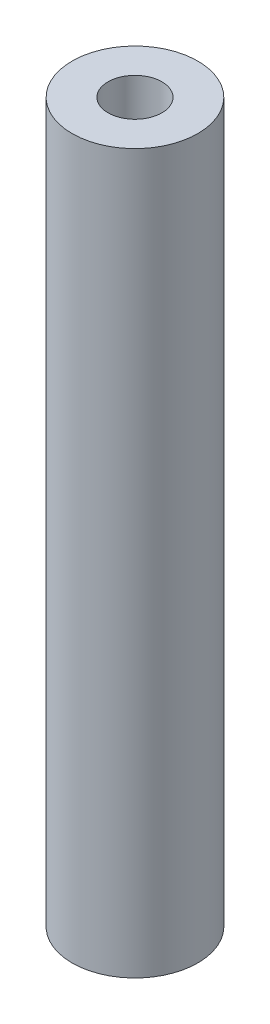
ISO-10303-21;
HEADER;
FILE_DESCRIPTION(('STEP AP214'),'2;1');
FILE_NAME('part.step','',(''),(''),'','','');
FILE_SCHEMA(('AUTOMOTIVE_DESIGN { 1 0 10303 214 1 1 1 1 }'));
ENDSEC;
DATA;
#1=APPLICATION_CONTEXT('core data for automotive mechanical design processes');
#2=APPLICATION_PROTOCOL_DEFINITION('international standard','automotive_design',2000,#1);
#3=PRODUCT_CONTEXT('',#1,'mechanical');
#4=PRODUCT('Part','Part','',(#3));
#5=PRODUCT_RELATED_PRODUCT_CATEGORY('part','',(#4));
#6=PRODUCT_DEFINITION_FORMATION('','',#4);
#7=PRODUCT_DEFINITION_CONTEXT('part definition',#1,'design');
#8=PRODUCT_DEFINITION('design','',#6,#7);
#9=PRODUCT_DEFINITION_SHAPE('','',#8);
#10=(LENGTH_UNIT() NAMED_UNIT(*) SI_UNIT(.MILLI.,.METRE.));
#11=(NAMED_UNIT(*) PLANE_ANGLE_UNIT() SI_UNIT($,.RADIAN.));
#12=(NAMED_UNIT(*) SI_UNIT($,.STERADIAN.) SOLID_ANGLE_UNIT());
#13=UNCERTAINTY_MEASURE_WITH_UNIT(LENGTH_MEASURE(1.E-05),#10,'distance_accuracy_value','');
#14=(GEOMETRIC_REPRESENTATION_CONTEXT(3) GLOBAL_UNCERTAINTY_ASSIGNED_CONTEXT((#13)) GLOBAL_UNIT_ASSIGNED_CONTEXT((#10,
#11,#12)) REPRESENTATION_CONTEXT('',''));
#15=CARTESIAN_POINT('',(0.,0.,0.));
#16=DIRECTION('',(0.,0.,1.));
#17=DIRECTION('',(1.,0.,0.));
#18=AXIS2_PLACEMENT_3D('',#15,#16,#17);
#19=CARTESIAN_POINT('',(0.,40.,0.));
#20=DIRECTION('',(0.,1.,0.));
#21=DIRECTION('',(0.,0.,1.));
#22=AXIS2_PLACEMENT_3D('',#19,#20,#21);
#23=PLANE('',#22);
#24=CARTESIAN_POINT('',(0.,40.,0.));
#25=DIRECTION('',(0.,1.,0.));
#26=DIRECTION('',(0.,0.,1.));
#27=AXIS2_PLACEMENT_3D('',#24,#25,#26);
#28=CIRCLE('',#27,3.5);
#29=CARTESIAN_POINT('',(0.,40.,3.5));
#30=VERTEX_POINT('',#29);
#31=EDGE_CURVE('E10',#30,#30,#28,.T.);
#32=ORIENTED_EDGE('',*,*,#31,.T.);
#33=EDGE_LOOP('',(#32));
#34=FACE_BOUND('',#33,.T.);
#35=CARTESIAN_POINT('',(0.,40.,0.));
#36=DIRECTION('',(0.,1.,0.));
#37=DIRECTION('',(0.,0.,1.));
#38=AXIS2_PLACEMENT_3D('',#35,#36,#37);
#39=CIRCLE('',#38,1.5);
#40=CARTESIAN_POINT('',(0.,40.,1.5));
#41=VERTEX_POINT('',#40);
#42=EDGE_CURVE('E42',#41,#41,#39,.T.);
#43=ORIENTED_EDGE('',*,*,#42,.F.);
#44=EDGE_LOOP('',(#43));
#45=FACE_BOUND('',#44,.T.);
#46=ADVANCED_FACE('F31',(#34,#45),#23,.T.);
#47=CARTESIAN_POINT('',(0.,0.,0.));
#48=DIRECTION('',(0.,1.,0.));
#49=DIRECTION('',(0.,0.,1.));
#50=AXIS2_PLACEMENT_3D('',#47,#48,#49);
#51=PLANE('',#50);
#52=CARTESIAN_POINT('',(0.,0.,0.));
#53=DIRECTION('',(0.,1.,0.));
#54=DIRECTION('',(0.,0.,1.));
#55=AXIS2_PLACEMENT_3D('',#52,#53,#54);
#56=CIRCLE('',#55,3.5);
#57=CARTESIAN_POINT('',(0.,0.,3.5));
#58=VERTEX_POINT('',#57);
#59=EDGE_CURVE('E35',#58,#58,#56,.T.);
#60=ORIENTED_EDGE('',*,*,#59,.F.);
#61=EDGE_LOOP('',(#60));
#62=FACE_BOUND('',#61,.T.);
#63=CARTESIAN_POINT('',(0.,0.,0.));
#64=DIRECTION('',(0.,1.,0.));
#65=DIRECTION('',(0.,0.,1.));
#66=AXIS2_PLACEMENT_3D('',#63,#64,#65);
#67=CIRCLE('',#66,1.5);
#68=CARTESIAN_POINT('',(0.,0.,1.5));
#69=VERTEX_POINT('',#68);
#70=EDGE_CURVE('E44',#69,#69,#67,.T.);
#71=ORIENTED_EDGE('',*,*,#70,.T.);
#72=EDGE_LOOP('',(#71));
#73=FACE_BOUND('',#72,.T.);
#74=ADVANCED_FACE('F54',(#62,#73),#51,.F.);
#75=CARTESIAN_POINT('',(0.,40.,0.));
#76=DIRECTION('',(0.,-1.,0.));
#77=DIRECTION('',(0.,0.,-1.));
#78=AXIS2_PLACEMENT_3D('',#75,#76,#77);
#79=CYLINDRICAL_SURFACE('',#78,3.5);
#80=ORIENTED_EDGE('',*,*,#31,.F.);
#81=EDGE_LOOP('',(#80));
#82=FACE_BOUND('',#81,.T.);
#83=ORIENTED_EDGE('',*,*,#59,.T.);
#84=EDGE_LOOP('',(#83));
#85=FACE_BOUND('',#84,.T.);
#86=ADVANCED_FACE('F33',(#82,#85),#79,.T.);
#87=CARTESIAN_POINT('',(0.,40.,0.));
#88=DIRECTION('',(0.,-1.,0.));
#89=DIRECTION('',(0.,0.,-1.));
#90=AXIS2_PLACEMENT_3D('',#87,#88,#89);
#91=CYLINDRICAL_SURFACE('',#90,1.5);
#92=ORIENTED_EDGE('',*,*,#42,.T.);
#93=EDGE_LOOP('',(#92));
#94=FACE_BOUND('',#93,.T.);
#95=ORIENTED_EDGE('',*,*,#70,.F.);
#96=EDGE_LOOP('',(#95));
#97=FACE_BOUND('',#96,.T.);
#98=ADVANCED_FACE('F50',(#94,#97),#91,.F.);
#99=CLOSED_SHELL('',(#46,#74,#86,#98));
#100=MANIFOLD_SOLID_BREP('B2',#99);
#101=ADVANCED_BREP_SHAPE_REPRESENTATION('',(#18,#100),#14);
#102=SHAPE_DEFINITION_REPRESENTATION(#9,#101);
ENDSEC;
END-ISO-10303-21;
